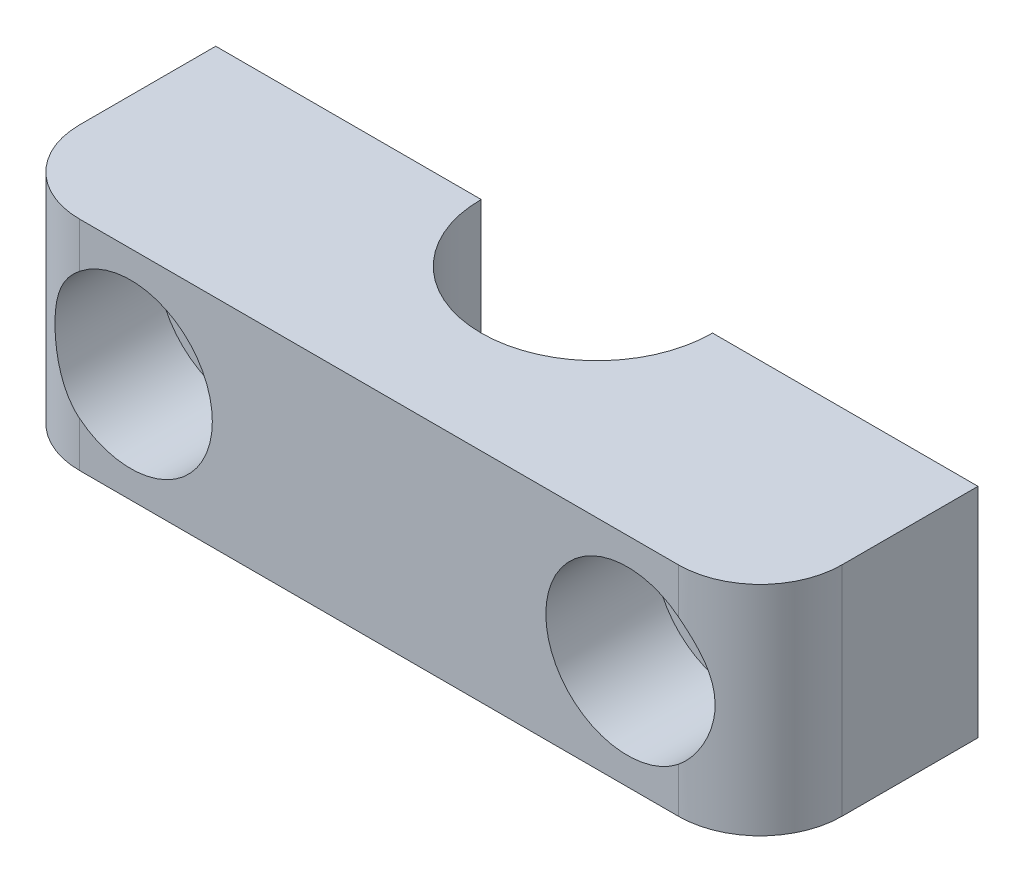
ISO-10303-21;
HEADER;
FILE_DESCRIPTION(('STEP AP214'),'2;1');
FILE_NAME('part.step','',(''),(''),'','','');
FILE_SCHEMA(('AUTOMOTIVE_DESIGN { 1 0 10303 214 1 1 1 1 }'));
ENDSEC;
DATA;
#1=APPLICATION_CONTEXT('core data for automotive mechanical design processes');
#2=APPLICATION_PROTOCOL_DEFINITION('international standard','automotive_design',2000,#1);
#3=PRODUCT_CONTEXT('',#1,'mechanical');
#4=PRODUCT('Part','Part','',(#3));
#5=PRODUCT_RELATED_PRODUCT_CATEGORY('part','',(#4));
#6=PRODUCT_DEFINITION_FORMATION('','',#4);
#7=PRODUCT_DEFINITION_CONTEXT('part definition',#1,'design');
#8=PRODUCT_DEFINITION('design','',#6,#7);
#9=PRODUCT_DEFINITION_SHAPE('','',#8);
#10=(LENGTH_UNIT() NAMED_UNIT(*) SI_UNIT(.MILLI.,.METRE.));
#11=(NAMED_UNIT(*) PLANE_ANGLE_UNIT() SI_UNIT($,.RADIAN.));
#12=(NAMED_UNIT(*) SI_UNIT($,.STERADIAN.) SOLID_ANGLE_UNIT());
#13=UNCERTAINTY_MEASURE_WITH_UNIT(LENGTH_MEASURE(1.E-05),#10,'distance_accuracy_value','');
#14=(GEOMETRIC_REPRESENTATION_CONTEXT(3) GLOBAL_UNCERTAINTY_ASSIGNED_CONTEXT((#13)) GLOBAL_UNIT_ASSIGNED_CONTEXT((#10,
#11,#12)) REPRESENTATION_CONTEXT('',''));
#15=CARTESIAN_POINT('',(0.,0.,0.));
#16=DIRECTION('',(0.,0.,1.));
#17=DIRECTION('',(1.,0.,0.));
#18=AXIS2_PLACEMENT_3D('',#15,#16,#17);
#19=CARTESIAN_POINT('',(23.125,-27.,0.));
#20=DIRECTION('',(0.,0.,-1.));
#21=DIRECTION('',(0.,1.,0.));
#22=AXIS2_PLACEMENT_3D('',#19,#20,#21);
#23=CYLINDRICAL_SURFACE('',#22,1.55);
#24=CARTESIAN_POINT('',(23.125,-27.,-8.));
#25=DIRECTION('',(0.,0.,-1.));
#26=DIRECTION('',(0.,1.,0.));
#27=AXIS2_PLACEMENT_3D('',#24,#25,#26);
#28=CIRCLE('',#27,1.55);
#29=CARTESIAN_POINT('',(23.125,-25.45,-8.));
#30=VERTEX_POINT('',#29);
#31=EDGE_CURVE('E268',#30,#30,#28,.T.);
#32=ORIENTED_EDGE('',*,*,#31,.T.);
#33=EDGE_LOOP('',(#32));
#34=FACE_BOUND('',#33,.T.);
#35=CARTESIAN_POINT('',(23.125,-27.,-4.));
#36=DIRECTION('',(0.,0.,1.));
#37=DIRECTION('',(1.,0.,0.));
#38=AXIS2_PLACEMENT_3D('',#35,#36,#37);
#39=CIRCLE('',#38,1.55);
#40=CARTESIAN_POINT('',(24.675,-27.,-4.));
#41=VERTEX_POINT('',#40);
#42=EDGE_CURVE('E44',#41,#41,#39,.F.);
#43=ORIENTED_EDGE('',*,*,#42,.F.);
#44=EDGE_LOOP('',(#43));
#45=FACE_BOUND('',#44,.T.);
#46=ADVANCED_FACE('F39',(#34,#45),#23,.F.);
#47=CARTESIAN_POINT('',(4.875,-27.,0.));
#48=DIRECTION('',(0.,0.,-1.));
#49=DIRECTION('',(0.,1.,0.));
#50=AXIS2_PLACEMENT_3D('',#47,#48,#49);
#51=CYLINDRICAL_SURFACE('',#50,1.55);
#52=CARTESIAN_POINT('',(4.875,-27.,-8.));
#53=DIRECTION('',(0.,0.,-1.));
#54=DIRECTION('',(0.,1.,0.));
#55=AXIS2_PLACEMENT_3D('',#52,#53,#54);
#56=CIRCLE('',#55,1.55);
#57=CARTESIAN_POINT('',(4.875,-25.45,-8.));
#58=VERTEX_POINT('',#57);
#59=EDGE_CURVE('E266',#58,#58,#56,.T.);
#60=ORIENTED_EDGE('',*,*,#59,.T.);
#61=EDGE_LOOP('',(#60));
#62=FACE_BOUND('',#61,.T.);
#63=CARTESIAN_POINT('',(4.875,-27.,-4.));
#64=DIRECTION('',(0.,0.,1.));
#65=DIRECTION('',(1.,0.,0.));
#66=AXIS2_PLACEMENT_3D('',#63,#64,#65);
#67=CIRCLE('',#66,1.55);
#68=CARTESIAN_POINT('',(6.425,-27.,-4.));
#69=VERTEX_POINT('',#68);
#70=EDGE_CURVE('E278',#69,#69,#67,.F.);
#71=ORIENTED_EDGE('',*,*,#70,.F.);
#72=EDGE_LOOP('',(#71));
#73=FACE_BOUND('',#72,.T.);
#74=ADVANCED_FACE('F170',(#62,#73),#51,.F.);
#75=CARTESIAN_POINT('',(0.,0.,-8.));
#76=DIRECTION('',(0.,0.,-1.));
#77=DIRECTION('',(-1.,0.,0.));
#78=AXIS2_PLACEMENT_3D('',#75,#76,#77);
#79=PLANE('',#78);
#80=ORIENTED_EDGE('',*,*,#59,.F.);
#81=EDGE_LOOP('',(#80));
#82=FACE_BOUND('',#81,.T.);
#83=DIRECTION('',(0.,1.,0.));
#84=VECTOR('',#83,1.);
#85=CARTESIAN_POINT('',(9.75,-31.,-8.));
#86=LINE('',#85,#84);
#87=CARTESIAN_POINT('',(9.75,-31.,-8.));
#88=VERTEX_POINT('',#87);
#89=CARTESIAN_POINT('',(9.75,-23.,-8.));
#90=VERTEX_POINT('',#89);
#91=EDGE_CURVE('E215',#88,#90,#86,.T.);
#92=ORIENTED_EDGE('',*,*,#91,.F.);
#93=DIRECTION('',(-1.,0.,0.));
#94=VECTOR('',#93,1.);
#95=CARTESIAN_POINT('',(0.,-31.,-8.));
#96=LINE('',#95,#94);
#97=CARTESIAN_POINT('',(0.,-31.,-8.));
#98=VERTEX_POINT('',#97);
#99=EDGE_CURVE('E252',#88,#98,#96,.T.);
#100=ORIENTED_EDGE('',*,*,#99,.T.);
#101=DIRECTION('',(0.,1.,0.));
#102=VECTOR('',#101,1.);
#103=CARTESIAN_POINT('',(0.,-31.,-8.));
#104=LINE('',#103,#102);
#105=CARTESIAN_POINT('',(0.,-23.,-8.));
#106=VERTEX_POINT('',#105);
#107=EDGE_CURVE('E218',#98,#106,#104,.T.);
#108=ORIENTED_EDGE('',*,*,#107,.T.);
#109=DIRECTION('',(1.,0.,0.));
#110=VECTOR('',#109,1.);
#111=CARTESIAN_POINT('',(0.,-23.,-8.));
#112=LINE('',#111,#110);
#113=EDGE_CURVE('E257',#106,#90,#112,.T.);
#114=ORIENTED_EDGE('',*,*,#113,.T.);
#115=EDGE_LOOP('',(#92,#100,#108,#114));
#116=FACE_BOUND('',#115,.T.);
#117=ADVANCED_FACE('F173',(#82,#116),#79,.T.);
#118=CARTESIAN_POINT('',(0.,-31.,-8.));
#119=DIRECTION('',(1.,0.,0.));
#120=DIRECTION('',(0.,1.,0.));
#121=AXIS2_PLACEMENT_3D('',#118,#119,#120);
#122=PLANE('',#121);
#123=DIRECTION('',(0.,0.,1.));
#124=VECTOR('',#123,1.);
#125=CARTESIAN_POINT('',(0.,-31.,-8.));
#126=LINE('',#125,#124);
#127=CARTESIAN_POINT('',(0.,-31.,-3.));
#128=VERTEX_POINT('',#127);
#129=EDGE_CURVE('E226',#98,#128,#126,.T.);
#130=ORIENTED_EDGE('',*,*,#129,.T.);
#131=DIRECTION('',(0.,1.,0.));
#132=VECTOR('',#131,1.);
#133=CARTESIAN_POINT('',(0.,-31.,-3.));
#134=LINE('',#133,#132);
#135=CARTESIAN_POINT('',(0.,-23.,-3.));
#136=VERTEX_POINT('',#135);
#137=EDGE_CURVE('E238',#128,#136,#134,.T.);
#138=ORIENTED_EDGE('',*,*,#137,.T.);
#139=DIRECTION('',(0.,0.,1.));
#140=VECTOR('',#139,1.);
#141=CARTESIAN_POINT('',(0.,-23.,-8.));
#142=LINE('',#141,#140);
#143=EDGE_CURVE('E235',#106,#136,#142,.T.);
#144=ORIENTED_EDGE('',*,*,#143,.F.);
#145=ORIENTED_EDGE('',*,*,#107,.F.);
#146=EDGE_LOOP('',(#130,#138,#144,#145));
#147=FACE_BOUND('',#146,.T.);
#148=ADVANCED_FACE('F200',(#147),#122,.F.);
#149=CARTESIAN_POINT('',(0.,-23.,-8.));
#150=DIRECTION('',(0.,-1.,0.));
#151=DIRECTION('',(0.,0.,-1.));
#152=AXIS2_PLACEMENT_3D('',#149,#150,#151);
#153=PLANE('',#152);
#154=ORIENTED_EDGE('',*,*,#143,.T.);
#155=CARTESIAN_POINT('',(3.,-23.,-3.));
#156=DIRECTION('',(0.,-1.,0.));
#157=DIRECTION('',(0.,0.,-1.));
#158=AXIS2_PLACEMENT_3D('',#155,#156,#157);
#159=CIRCLE('',#158,3.);
#160=CARTESIAN_POINT('',(3.,-23.,0.));
#161=VERTEX_POINT('',#160);
#162=EDGE_CURVE('E136',#136,#161,#159,.F.);
#163=ORIENTED_EDGE('',*,*,#162,.T.);
#164=DIRECTION('',(1.,0.,0.));
#165=VECTOR('',#164,1.);
#166=CARTESIAN_POINT('',(0.,-23.,0.));
#167=LINE('',#166,#165);
#168=CARTESIAN_POINT('',(25.,-23.,0.));
#169=VERTEX_POINT('',#168);
#170=EDGE_CURVE('E213',#161,#169,#167,.T.);
#171=ORIENTED_EDGE('',*,*,#170,.T.);
#172=CARTESIAN_POINT('',(25.,-23.,-3.));
#173=DIRECTION('',(0.,-1.,0.));
#174=DIRECTION('',(0.,0.,-1.));
#175=AXIS2_PLACEMENT_3D('',#172,#173,#174);
#176=CIRCLE('',#175,3.);
#177=CARTESIAN_POINT('',(28.,-23.,-3.));
#178=VERTEX_POINT('',#177);
#179=EDGE_CURVE('E135',#169,#178,#176,.F.);
#180=ORIENTED_EDGE('',*,*,#179,.T.);
#181=DIRECTION('',(0.,0.,1.));
#182=VECTOR('',#181,1.);
#183=CARTESIAN_POINT('',(28.,-23.,-8.));
#184=LINE('',#183,#182);
#185=CARTESIAN_POINT('',(28.,-23.,-8.));
#186=VERTEX_POINT('',#185);
#187=EDGE_CURVE('E232',#186,#178,#184,.T.);
#188=ORIENTED_EDGE('',*,*,#187,.F.);
#189=CARTESIAN_POINT('',(18.25,-23.,-8.));
#190=VERTEX_POINT('',#189);
#191=EDGE_CURVE('E259',#190,#186,#112,.T.);
#192=ORIENTED_EDGE('',*,*,#191,.F.);
#193=CARTESIAN_POINT('',(14.,-23.,-8.));
#194=DIRECTION('',(0.,1.,0.));
#195=DIRECTION('',(0.,0.,-1.));
#196=AXIS2_PLACEMENT_3D('',#193,#194,#195);
#197=CIRCLE('',#196,4.25);
#198=EDGE_CURVE('E264',#90,#190,#197,.T.);
#199=ORIENTED_EDGE('',*,*,#198,.F.);
#200=ORIENTED_EDGE('',*,*,#113,.F.);
#201=EDGE_LOOP('',(#154,#163,#171,#180,#188,#192,#199,#200));
#202=FACE_BOUND('',#201,.T.);
#203=ADVANCED_FACE('F196',(#202),#153,.F.);
#204=CARTESIAN_POINT('',(28.,-31.,-8.));
#205=DIRECTION('',(-1.,0.,0.));
#206=DIRECTION('',(0.,0.,1.));
#207=AXIS2_PLACEMENT_3D('',#204,#205,#206);
#208=PLANE('',#207);
#209=ORIENTED_EDGE('',*,*,#187,.T.);
#210=DIRECTION('',(0.,-1.,0.));
#211=VECTOR('',#210,1.);
#212=CARTESIAN_POINT('',(28.,-31.,-3.));
#213=LINE('',#212,#211);
#214=CARTESIAN_POINT('',(28.,-31.,-3.));
#215=VERTEX_POINT('',#214);
#216=EDGE_CURVE('E121',#178,#215,#213,.T.);
#217=ORIENTED_EDGE('',*,*,#216,.T.);
#218=DIRECTION('',(0.,0.,1.));
#219=VECTOR('',#218,1.);
#220=CARTESIAN_POINT('',(28.,-31.,-8.));
#221=LINE('',#220,#219);
#222=CARTESIAN_POINT('',(28.,-31.,-8.));
#223=VERTEX_POINT('',#222);
#224=EDGE_CURVE('E229',#223,#215,#221,.T.);
#225=ORIENTED_EDGE('',*,*,#224,.F.);
#226=DIRECTION('',(0.,-1.,0.));
#227=VECTOR('',#226,1.);
#228=CARTESIAN_POINT('',(28.,-31.,-8.));
#229=LINE('',#228,#227);
#230=EDGE_CURVE('E244',#186,#223,#229,.T.);
#231=ORIENTED_EDGE('',*,*,#230,.F.);
#232=EDGE_LOOP('',(#209,#217,#225,#231));
#233=FACE_BOUND('',#232,.T.);
#234=ADVANCED_FACE('F192',(#233),#208,.F.);
#235=CARTESIAN_POINT('',(0.,-31.,-8.));
#236=DIRECTION('',(0.,1.,0.));
#237=DIRECTION('',(-1.,0.,0.));
#238=AXIS2_PLACEMENT_3D('',#235,#236,#237);
#239=PLANE('',#238);
#240=DIRECTION('',(-1.,0.,0.));
#241=VECTOR('',#240,1.);
#242=CARTESIAN_POINT('',(0.,-31.,0.));
#243=LINE('',#242,#241);
#244=CARTESIAN_POINT('',(25.,-31.,0.));
#245=VERTEX_POINT('',#244);
#246=CARTESIAN_POINT('',(3.,-31.,0.));
#247=VERTEX_POINT('',#246);
#248=EDGE_CURVE('E214',#245,#247,#243,.T.);
#249=ORIENTED_EDGE('',*,*,#248,.T.);
#250=CARTESIAN_POINT('',(3.,-31.,-3.));
#251=DIRECTION('',(0.,1.,0.));
#252=DIRECTION('',(-1.,0.,0.));
#253=AXIS2_PLACEMENT_3D('',#250,#251,#252);
#254=CIRCLE('',#253,3.);
#255=EDGE_CURVE('E146',#247,#128,#254,.F.);
#256=ORIENTED_EDGE('',*,*,#255,.T.);
#257=ORIENTED_EDGE('',*,*,#129,.F.);
#258=ORIENTED_EDGE('',*,*,#99,.F.);
#259=CARTESIAN_POINT('',(14.,-31.,-8.));
#260=DIRECTION('',(0.,1.,0.));
#261=DIRECTION('',(0.,0.,-1.));
#262=AXIS2_PLACEMENT_3D('',#259,#260,#261);
#263=CIRCLE('',#262,4.25);
#264=CARTESIAN_POINT('',(18.25,-31.,-8.));
#265=VERTEX_POINT('',#264);
#266=EDGE_CURVE('E249',#88,#265,#263,.T.);
#267=ORIENTED_EDGE('',*,*,#266,.T.);
#268=EDGE_CURVE('E223',#223,#265,#96,.T.);
#269=ORIENTED_EDGE('',*,*,#268,.F.);
#270=ORIENTED_EDGE('',*,*,#224,.T.);
#271=CARTESIAN_POINT('',(25.,-31.,-3.));
#272=DIRECTION('',(0.,1.,0.));
#273=DIRECTION('',(-1.,0.,0.));
#274=AXIS2_PLACEMENT_3D('',#271,#272,#273);
#275=CIRCLE('',#274,3.);
#276=EDGE_CURVE('E144',#215,#245,#275,.F.);
#277=ORIENTED_EDGE('',*,*,#276,.T.);
#278=EDGE_LOOP('',(#249,#256,#257,#258,#267,#269,#270,#277));
#279=FACE_BOUND('',#278,.T.);
#280=ADVANCED_FACE('F186',(#279),#239,.F.);
#281=ORIENTED_EDGE('',*,*,#31,.F.);
#282=EDGE_LOOP('',(#281));
#283=FACE_BOUND('',#282,.T.);
#284=DIRECTION('',(0.,1.,0.));
#285=VECTOR('',#284,1.);
#286=CARTESIAN_POINT('',(18.25,-31.,-8.));
#287=LINE('',#286,#285);
#288=EDGE_CURVE('E220',#265,#190,#287,.T.);
#289=ORIENTED_EDGE('',*,*,#288,.T.);
#290=ORIENTED_EDGE('',*,*,#191,.T.);
#291=ORIENTED_EDGE('',*,*,#230,.T.);
#292=ORIENTED_EDGE('',*,*,#268,.T.);
#293=EDGE_LOOP('',(#289,#290,#291,#292));
#294=FACE_BOUND('',#293,.T.);
#295=ADVANCED_FACE('F183',(#283,#294),#79,.T.);
#296=CARTESIAN_POINT('',(0.,0.,0.));
#297=DIRECTION('',(0.,0.,-1.));
#298=DIRECTION('',(-1.,0.,0.));
#299=AXIS2_PLACEMENT_3D('',#296,#297,#298);
#300=PLANE('',#299);
#301=DIRECTION('',(0.,1.,0.));
#302=VECTOR('',#301,1.);
#303=CARTESIAN_POINT('',(3.,0.,0.));
#304=LINE('',#303,#302);
#305=CARTESIAN_POINT('',(3.,-24.6581257506006,0.));
#306=VERTEX_POINT('',#305);
#307=EDGE_CURVE('E142',#161,#306,#304,.F.);
#308=ORIENTED_EDGE('',*,*,#307,.T.);
#309=CARTESIAN_POINT('',(4.875,-27.,0.));
#310=DIRECTION('',(0.,0.,1.));
#311=DIRECTION('',(1.,0.,0.));
#312=AXIS2_PLACEMENT_3D('',#309,#310,#311);
#313=CIRCLE('',#312,3.);
#314=CARTESIAN_POINT('',(3.,-29.3418742493994,0.));
#315=VERTEX_POINT('',#314);
#316=EDGE_CURVE('E55',#315,#306,#313,.T.);
#317=ORIENTED_EDGE('',*,*,#316,.F.);
#318=EDGE_CURVE('E138',#315,#247,#304,.F.);
#319=ORIENTED_EDGE('',*,*,#318,.T.);
#320=ORIENTED_EDGE('',*,*,#248,.F.);
#321=DIRECTION('',(0.,-1.,0.));
#322=VECTOR('',#321,1.);
#323=CARTESIAN_POINT('',(25.,0.,0.));
#324=LINE('',#323,#322);
#325=CARTESIAN_POINT('',(25.,-29.3418742493994,0.));
#326=VERTEX_POINT('',#325);
#327=EDGE_CURVE('E130',#245,#326,#324,.F.);
#328=ORIENTED_EDGE('',*,*,#327,.T.);
#329=CARTESIAN_POINT('',(23.125,-27.,0.));
#330=DIRECTION('',(0.,0.,1.));
#331=DIRECTION('',(1.,0.,0.));
#332=AXIS2_PLACEMENT_3D('',#329,#330,#331);
#333=CIRCLE('',#332,3.);
#334=CARTESIAN_POINT('',(25.,-24.6581257506006,0.));
#335=VERTEX_POINT('',#334);
#336=EDGE_CURVE('E62',#335,#326,#333,.T.);
#337=ORIENTED_EDGE('',*,*,#336,.F.);
#338=EDGE_CURVE('E127',#335,#169,#324,.F.);
#339=ORIENTED_EDGE('',*,*,#338,.T.);
#340=ORIENTED_EDGE('',*,*,#170,.F.);
#341=EDGE_LOOP('',(#308,#317,#319,#320,#328,#337,#339,#340));
#342=FACE_BOUND('',#341,.T.);
#343=ADVANCED_FACE('F125',(#342),#300,.F.);
#344=CARTESIAN_POINT('',(14.,-31.,-8.));
#345=DIRECTION('',(0.,1.,0.));
#346=DIRECTION('',(0.,0.,1.));
#347=AXIS2_PLACEMENT_3D('',#344,#345,#346);
#348=CYLINDRICAL_SURFACE('',#347,4.25);
#349=ORIENTED_EDGE('',*,*,#198,.T.);
#350=ORIENTED_EDGE('',*,*,#288,.F.);
#351=ORIENTED_EDGE('',*,*,#266,.F.);
#352=ORIENTED_EDGE('',*,*,#91,.T.);
#353=EDGE_LOOP('',(#349,#350,#351,#352));
#354=FACE_BOUND('',#353,.T.);
#355=ADVANCED_FACE('F178',(#354),#348,.F.);
#356=CARTESIAN_POINT('',(3.,-31.,-3.));
#357=DIRECTION('',(0.,1.,0.));
#358=DIRECTION('',(-1.,0.,0.));
#359=AXIS2_PLACEMENT_3D('',#356,#357,#358);
#360=CYLINDRICAL_SURFACE('',#359,3.);
#361=CARTESIAN_POINT('',(3.,-24.6581257506006,0.));
#362=CARTESIAN_POINT('',(2.93556614553365,-24.7096989063948,2.07807333388228E-06));
#363=CARTESIAN_POINT('',(2.8733103065956,-24.7639208060747,-0.00207530779387547));
#364=CARTESIAN_POINT('',(2.75362403587313,-24.8771424397741,-0.00953408783989639));
#365=CARTESIAN_POINT('',(2.69618906381767,-24.9361375731401,-0.0149123326776091));
#366=CARTESIAN_POINT('',(2.58659169277791,-25.058372165479,-0.0281088560778316));
#367=CARTESIAN_POINT('',(2.53441967659224,-25.1216035180379,-0.0359225732345553));
#368=CARTESIAN_POINT('',(2.43551168756895,-25.2519734731597,-0.0531588343302108));
#369=CARTESIAN_POINT('',(2.38877701986845,-25.3191130080325,-0.0625817631973143));
#370=CARTESIAN_POINT('',(2.25736936656525,-25.525376789717,-0.091985343310439));
#371=CARTESIAN_POINT('',(2.1810922238458,-25.6697947250572,-0.11316043577916));
#372=CARTESIAN_POINT('',(2.05283902831061,-25.9694881036995,-0.152643788378683));
#373=CARTESIAN_POINT('',(2.00086738101591,-26.1247655094888,-0.170951528384489));
#374=CARTESIAN_POINT('',(1.94157854928243,-26.3657744216811,-0.192833419252328));
#375=CARTESIAN_POINT('',(1.92480816543572,-26.4490117158576,-0.199257983889868));
#376=CARTESIAN_POINT('',(1.89836584096984,-26.6167861424587,-0.209549961191297));
#377=CARTESIAN_POINT('',(1.8886939600511,-26.7013232858093,-0.213417352348607));
#378=CARTESIAN_POINT('',(1.87657199753751,-26.8709402980586,-0.218282749000843));
#379=CARTESIAN_POINT('',(1.87411740785461,-26.9560197948896,-0.219282545652443));
#380=CARTESIAN_POINT('',(1.87644404361767,-27.1260600595651,-0.218341503422119));
#381=CARTESIAN_POINT('',(1.88122487212328,-27.2110208336669,-0.216400825856758));
#382=CARTESIAN_POINT('',(1.89737576607526,-27.3741507042876,-0.209966120679634));
#383=CARTESIAN_POINT('',(1.90825712566353,-27.4523760498827,-0.205661906651145));
#384=CARTESIAN_POINT('',(1.93611344118825,-27.60759612178,-0.194939755540882));
#385=CARTESIAN_POINT('',(1.95309058984322,-27.6845903948295,-0.188521057926101));
#386=CARTESIAN_POINT('',(2.0130006156678,-27.9130833011132,-0.166684520394121));
#387=CARTESIAN_POINT('',(2.06491077537798,-28.0620791320433,-0.148686858285088));
#388=CARTESIAN_POINT('',(2.19355126910104,-28.3551611047847,-0.109619155897692));
#389=CARTESIAN_POINT('',(2.27113869704831,-28.4988541179794,-0.0884592653149068));
#390=CARTESIAN_POINT('',(2.4487604127919,-28.7719386677312,-0.0496859204270274));
#391=CARTESIAN_POINT('',(2.54874732225769,-28.9013595422035,-0.032065127443899));
#392=CARTESIAN_POINT('',(2.7112917197133,-29.0795321090591,-0.0134566967145421));
#393=CARTESIAN_POINT('',(2.76609154721984,-29.1350865101238,-0.00858928719039424));
#394=CARTESIAN_POINT('',(2.87993923777445,-29.2418344032867,-0.00186099537992529));
#395=CARTESIAN_POINT('',(2.93898662756268,-29.2930283798359,2.2131360163389E-07));
#396=CARTESIAN_POINT('',(3.,-29.3418742493994,0.));
#397=B_SPLINE_CURVE_WITH_KNOTS('',3,(#361,#362,#363,#364,#365,#366,#367,#368,#369,#370,#371,
#372,#373,#374,#375,#376,#377,#378,#379,#380,#381,#382,#383,#384,#385,#386,#387,#388,#389,#390,
#391,#392,#393,#394,#395,#396),.UNSPECIFIED.,.F.,.F.,(4,2,2,2,2,2,2,2,2,2,2,2,2,2,2,2,2,4),(0.,
0.247433388198061,0.494631067037288,0.741368522443308,0.988165081055148,1.47996728762749,
1.97185860186899,2.22702299530513,2.48218953472146,2.73719665728596,2.99218979048011,
3.22919176931535,3.46627908576649,3.94049215955731,4.43247317962877,4.92342324828804,
5.15772396313945,5.39199861271517),.UNSPECIFIED.);
#398=EDGE_CURVE('E11',#306,#315,#397,.T.);
#399=ORIENTED_EDGE('',*,*,#398,.F.);
#400=ORIENTED_EDGE('',*,*,#307,.F.);
#401=ORIENTED_EDGE('',*,*,#162,.F.);
#402=ORIENTED_EDGE('',*,*,#137,.F.);
#403=ORIENTED_EDGE('',*,*,#255,.F.);
#404=ORIENTED_EDGE('',*,*,#318,.F.);
#405=EDGE_LOOP('',(#399,#400,#401,#402,#403,#404));
#406=FACE_BOUND('',#405,.T.);
#407=ADVANCED_FACE('F181',(#406),#360,.T.);
#408=CARTESIAN_POINT('',(25.,-31.,-3.));
#409=DIRECTION('',(0.,-1.,0.));
#410=DIRECTION('',(0.,0.,-1.));
#411=AXIS2_PLACEMENT_3D('',#408,#409,#410);
#412=CYLINDRICAL_SURFACE('',#411,3.);
#413=CARTESIAN_POINT('',(25.,-29.3418742493994,0.));
#414=CARTESIAN_POINT('',(25.0644338544664,-29.2903010936052,2.07807333407802E-06));
#415=CARTESIAN_POINT('',(25.1266896934044,-29.2360791939253,-0.00207530779387544));
#416=CARTESIAN_POINT('',(25.2463759641269,-29.1228575602259,-0.00953408783989678));
#417=CARTESIAN_POINT('',(25.3038109361823,-29.0638624268599,-0.0149123326776097));
#418=CARTESIAN_POINT('',(25.4134083072221,-28.941627834521,-0.0281088560778321));
#419=CARTESIAN_POINT('',(25.4655803234078,-28.878396481962,-0.0359225732345556));
#420=CARTESIAN_POINT('',(25.5644883124311,-28.7480265268403,-0.0531588343302106));
#421=CARTESIAN_POINT('',(25.6112229801315,-28.6808869919675,-0.062581763197314));
#422=CARTESIAN_POINT('',(25.7426306334348,-28.474623210283,-0.0919853433104385));
#423=CARTESIAN_POINT('',(25.8189077761542,-28.3302052749428,-0.11316043577916));
#424=CARTESIAN_POINT('',(25.9471609716894,-28.0305118963005,-0.152643788378683));
#425=CARTESIAN_POINT('',(25.9991326189841,-27.8752344905112,-0.170951528384489));
#426=CARTESIAN_POINT('',(26.0584214507176,-27.6342255783189,-0.192833419252328));
#427=CARTESIAN_POINT('',(26.0751918345643,-27.5509882841424,-0.199257983889869));
#428=CARTESIAN_POINT('',(26.1016341590302,-27.3832138575413,-0.209549961191298));
#429=CARTESIAN_POINT('',(26.1113060399489,-27.2986767141907,-0.213417352348607));
#430=CARTESIAN_POINT('',(26.1234280024625,-27.1290597019414,-0.218282749000843));
#431=CARTESIAN_POINT('',(26.1258825921454,-27.0439802051104,-0.219282545652442));
#432=CARTESIAN_POINT('',(26.1235559563823,-26.8739399404349,-0.218341503422119));
#433=CARTESIAN_POINT('',(26.1187751278767,-26.7889791663331,-0.216400825856757));
#434=CARTESIAN_POINT('',(26.1026242339247,-26.6258492957124,-0.209966120679633));
#435=CARTESIAN_POINT('',(26.0917428743365,-26.5476239501173,-0.205661906651144));
#436=CARTESIAN_POINT('',(26.0638865588118,-26.39240387822,-0.194939755540882));
#437=CARTESIAN_POINT('',(26.0469094101568,-26.3154096051705,-0.188521057926101));
#438=CARTESIAN_POINT('',(25.9869993843322,-26.0869166988867,-0.166684520394122));
#439=CARTESIAN_POINT('',(25.935089224622,-25.9379208679567,-0.148686858285088));
#440=CARTESIAN_POINT('',(25.806448730899,-25.6448388952153,-0.109619155897692));
#441=CARTESIAN_POINT('',(25.7288613029517,-25.5011458820205,-0.0884592653149062));
#442=CARTESIAN_POINT('',(25.5512395872081,-25.2280613322688,-0.0496859204270268));
#443=CARTESIAN_POINT('',(25.4512526777423,-25.0986404577965,-0.0320651274438987));
#444=CARTESIAN_POINT('',(25.2887082802867,-24.9204678909409,-0.0134566967145417));
#445=CARTESIAN_POINT('',(25.2339084527802,-24.8649134898762,-0.00858928719039372));
#446=CARTESIAN_POINT('',(25.1200607622255,-24.7581655967133,-0.00186099537992492));
#447=CARTESIAN_POINT('',(25.0610133724373,-24.7069716201641,2.21313601850797E-07));
#448=CARTESIAN_POINT('',(25.,-24.6581257506006,0.));
#449=B_SPLINE_CURVE_WITH_KNOTS('',3,(#413,#414,#415,#416,#417,#418,#419,#420,#421,#422,#423,
#424,#425,#426,#427,#428,#429,#430,#431,#432,#433,#434,#435,#436,#437,#438,#439,#440,#441,#442,
#443,#444,#445,#446,#447,#448),.UNSPECIFIED.,.F.,.F.,(4,2,2,2,2,2,2,2,2,2,2,2,2,2,2,2,2,4),(0.,
0.247433388198063,0.494631067037289,0.741368522443307,0.988165081055151,1.47996728762749,
1.97185860186899,2.22702299530513,2.48218953472146,2.73719665728596,2.99218979048011,
3.22919176931535,3.46627908576649,3.94049215955731,4.43247317962877,4.92342324828804,
5.15772396313946,5.39199861271517),.UNSPECIFIED.);
#450=EDGE_CURVE('E49',#326,#335,#449,.T.);
#451=ORIENTED_EDGE('',*,*,#450,.F.);
#452=ORIENTED_EDGE('',*,*,#327,.F.);
#453=ORIENTED_EDGE('',*,*,#276,.F.);
#454=ORIENTED_EDGE('',*,*,#216,.F.);
#455=ORIENTED_EDGE('',*,*,#179,.F.);
#456=ORIENTED_EDGE('',*,*,#338,.F.);
#457=EDGE_LOOP('',(#451,#452,#453,#454,#455,#456));
#458=FACE_BOUND('',#457,.T.);
#459=ADVANCED_FACE('F41',(#458),#412,.T.);
#460=CARTESIAN_POINT('',(23.125,-27.,-4.));
#461=DIRECTION('',(0.,0.,1.));
#462=DIRECTION('',(1.,0.,0.));
#463=AXIS2_PLACEMENT_3D('',#460,#461,#462);
#464=PLANE('',#463);
#465=CARTESIAN_POINT('',(23.125,-27.,-4.));
#466=DIRECTION('',(0.,0.,1.));
#467=DIRECTION('',(1.,0.,0.));
#468=AXIS2_PLACEMENT_3D('',#465,#466,#467);
#469=CIRCLE('',#468,3.);
#470=CARTESIAN_POINT('',(26.125,-27.,-4.));
#471=VERTEX_POINT('',#470);
#472=EDGE_CURVE('E131',#471,#471,#469,.T.);
#473=ORIENTED_EDGE('',*,*,#472,.T.);
#474=EDGE_LOOP('',(#473));
#475=FACE_BOUND('',#474,.T.);
#476=ORIENTED_EDGE('',*,*,#42,.T.);
#477=EDGE_LOOP('',(#476));
#478=FACE_BOUND('',#477,.T.);
#479=ADVANCED_FACE('F163',(#475,#478),#464,.T.);
#480=CARTESIAN_POINT('',(23.125,-27.,-4.));
#481=DIRECTION('',(0.,0.,1.));
#482=DIRECTION('',(1.,0.,0.));
#483=AXIS2_PLACEMENT_3D('',#480,#481,#482);
#484=CYLINDRICAL_SURFACE('',#483,3.);
#485=ORIENTED_EDGE('',*,*,#450,.T.);
#486=ORIENTED_EDGE('',*,*,#336,.T.);
#487=EDGE_LOOP('',(#485,#486));
#488=FACE_BOUND('',#487,.T.);
#489=ORIENTED_EDGE('',*,*,#472,.F.);
#490=EDGE_LOOP('',(#489));
#491=FACE_BOUND('',#490,.T.);
#492=ADVANCED_FACE('F115',(#488,#491),#484,.F.);
#493=CARTESIAN_POINT('',(4.875,-27.,-4.));
#494=DIRECTION('',(0.,0.,1.));
#495=DIRECTION('',(1.,0.,0.));
#496=AXIS2_PLACEMENT_3D('',#493,#494,#495);
#497=PLANE('',#496);
#498=CARTESIAN_POINT('',(4.875,-27.,-4.));
#499=DIRECTION('',(0.,0.,1.));
#500=DIRECTION('',(1.,0.,0.));
#501=AXIS2_PLACEMENT_3D('',#498,#499,#500);
#502=CIRCLE('',#501,3.);
#503=CARTESIAN_POINT('',(7.875,-27.,-4.));
#504=VERTEX_POINT('',#503);
#505=EDGE_CURVE('E276',#504,#504,#502,.T.);
#506=ORIENTED_EDGE('',*,*,#505,.T.);
#507=EDGE_LOOP('',(#506));
#508=FACE_BOUND('',#507,.T.);
#509=ORIENTED_EDGE('',*,*,#70,.T.);
#510=EDGE_LOOP('',(#509));
#511=FACE_BOUND('',#510,.T.);
#512=ADVANCED_FACE('F162',(#508,#511),#497,.T.);
#513=CARTESIAN_POINT('',(4.875,-27.,-4.));
#514=DIRECTION('',(0.,0.,1.));
#515=DIRECTION('',(1.,0.,0.));
#516=AXIS2_PLACEMENT_3D('',#513,#514,#515);
#517=CYLINDRICAL_SURFACE('',#516,3.);
#518=ORIENTED_EDGE('',*,*,#398,.T.);
#519=ORIENTED_EDGE('',*,*,#316,.T.);
#520=EDGE_LOOP('',(#518,#519));
#521=FACE_BOUND('',#520,.T.);
#522=ORIENTED_EDGE('',*,*,#505,.F.);
#523=EDGE_LOOP('',(#522));
#524=FACE_BOUND('',#523,.T.);
#525=ADVANCED_FACE('F164',(#521,#524),#517,.F.);
#526=CLOSED_SHELL('',(#46,#74,#117,#148,#203,#234,#280,#295,#343,#355,#407,#459,#479,#492,#512,#525));
#527=MANIFOLD_SOLID_BREP('B2',#526);
#528=ADVANCED_BREP_SHAPE_REPRESENTATION('',(#18,#527),#14);
#529=SHAPE_DEFINITION_REPRESENTATION(#9,#528);
ENDSEC;
END-ISO-10303-21;
